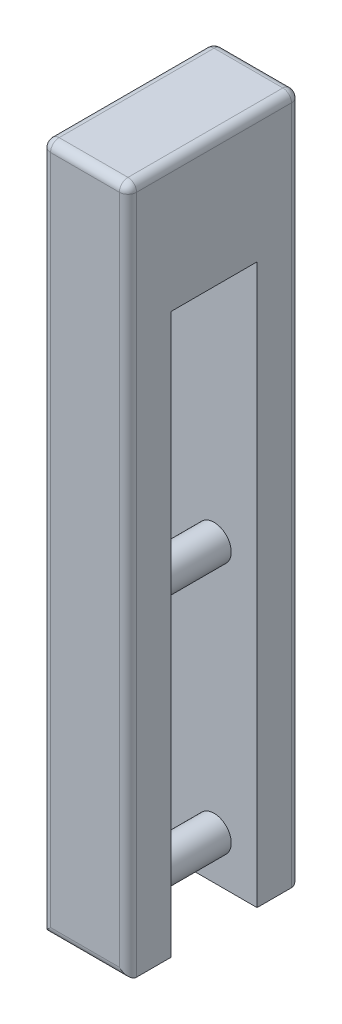
ISO-10303-21;
HEADER;
FILE_DESCRIPTION(('STEP AP214'),'2;1');
FILE_NAME('part.step','',(''),(''),'','','');
FILE_SCHEMA(('AUTOMOTIVE_DESIGN { 1 0 10303 214 1 1 1 1 }'));
ENDSEC;
DATA;
#1=APPLICATION_CONTEXT('core data for automotive mechanical design processes');
#2=APPLICATION_PROTOCOL_DEFINITION('international standard','automotive_design',2000,#1);
#3=PRODUCT_CONTEXT('',#1,'mechanical');
#4=PRODUCT('Part','Part','',(#3));
#5=PRODUCT_RELATED_PRODUCT_CATEGORY('part','',(#4));
#6=PRODUCT_DEFINITION_FORMATION('','',#4);
#7=PRODUCT_DEFINITION_CONTEXT('part definition',#1,'design');
#8=PRODUCT_DEFINITION('design','',#6,#7);
#9=PRODUCT_DEFINITION_SHAPE('','',#8);
#10=(LENGTH_UNIT() NAMED_UNIT(*) SI_UNIT(.MILLI.,.METRE.));
#11=(NAMED_UNIT(*) PLANE_ANGLE_UNIT() SI_UNIT($,.RADIAN.));
#12=(NAMED_UNIT(*) SI_UNIT($,.STERADIAN.) SOLID_ANGLE_UNIT());
#13=UNCERTAINTY_MEASURE_WITH_UNIT(LENGTH_MEASURE(1.E-05),#10,'distance_accuracy_value','');
#14=(GEOMETRIC_REPRESENTATION_CONTEXT(3) GLOBAL_UNCERTAINTY_ASSIGNED_CONTEXT((#13)) GLOBAL_UNIT_ASSIGNED_CONTEXT((#10,
#11,#12)) REPRESENTATION_CONTEXT('',''));
#15=CARTESIAN_POINT('',(0.,0.,0.));
#16=DIRECTION('',(0.,0.,1.));
#17=DIRECTION('',(1.,0.,0.));
#18=AXIS2_PLACEMENT_3D('',#15,#16,#17);
#19=CARTESIAN_POINT('',(0.,0.,5.));
#20=DIRECTION('',(0.,0.,-1.));
#21=DIRECTION('',(-1.,0.,0.));
#22=AXIS2_PLACEMENT_3D('',#19,#20,#21);
#23=PLANE('',#22);
#24=CARTESIAN_POINT('',(5.,5.,5.));
#25=DIRECTION('',(0.,0.,-1.));
#26=DIRECTION('',(-1.,0.,0.));
#27=AXIS2_PLACEMENT_3D('',#24,#25,#26);
#28=CIRCLE('',#27,2.);
#29=CARTESIAN_POINT('',(3.,5.,5.));
#30=VERTEX_POINT('',#29);
#31=EDGE_CURVE('E186',#30,#30,#28,.F.);
#32=ORIENTED_EDGE('',*,*,#31,.F.);
#33=EDGE_LOOP('',(#32));
#34=FACE_BOUND('',#33,.T.);
#35=CARTESIAN_POINT('',(5.,34.2857142857143,5.));
#36=DIRECTION('',(0.,0.,-1.));
#37=DIRECTION('',(-1.,0.,0.));
#38=AXIS2_PLACEMENT_3D('',#35,#36,#37);
#39=CIRCLE('',#38,2.);
#40=CARTESIAN_POINT('',(3.,34.2857142857143,5.));
#41=VERTEX_POINT('',#40);
#42=EDGE_CURVE('E189',#41,#41,#39,.F.);
#43=ORIENTED_EDGE('',*,*,#42,.F.);
#44=EDGE_LOOP('',(#43));
#45=FACE_BOUND('',#44,.T.);
#46=DIRECTION('',(1.,0.,0.));
#47=VECTOR('',#46,1.);
#48=CARTESIAN_POINT('',(0.,65.,5.));
#49=LINE('',#48,#47);
#50=CARTESIAN_POINT('',(0.,65.,5.));
#51=VERTEX_POINT('',#50);
#52=CARTESIAN_POINT('',(10.,65.,5.));
#53=VERTEX_POINT('',#52);
#54=EDGE_CURVE('E143',#51,#53,#49,.T.);
#55=ORIENTED_EDGE('',*,*,#54,.F.);
#56=DIRECTION('',(0.,-1.,0.));
#57=VECTOR('',#56,1.);
#58=CARTESIAN_POINT('',(0.,0.,5.));
#59=LINE('',#58,#57);
#60=CARTESIAN_POINT('',(0.,0.,5.));
#61=VERTEX_POINT('',#60);
#62=EDGE_CURVE('E152',#51,#61,#59,.T.);
#63=ORIENTED_EDGE('',*,*,#62,.T.);
#64=DIRECTION('',(1.,0.,0.));
#65=VECTOR('',#64,1.);
#66=CARTESIAN_POINT('',(0.,0.,5.));
#67=LINE('',#66,#65);
#68=CARTESIAN_POINT('',(10.,0.,5.));
#69=VERTEX_POINT('',#68);
#70=EDGE_CURVE('E176',#61,#69,#67,.T.);
#71=ORIENTED_EDGE('',*,*,#70,.T.);
#72=DIRECTION('',(0.,1.,0.));
#73=VECTOR('',#72,1.);
#74=CARTESIAN_POINT('',(10.,0.,5.));
#75=LINE('',#74,#73);
#76=EDGE_CURVE('E178',#69,#53,#75,.T.);
#77=ORIENTED_EDGE('',*,*,#76,.T.);
#78=EDGE_LOOP('',(#55,#63,#71,#77));
#79=FACE_BOUND('',#78,.T.);
#80=ADVANCED_FACE('F33',(#34,#45,#79),#23,.F.);
#81=CARTESIAN_POINT('',(0.,0.,15.));
#82=DIRECTION('',(0.,0.,1.));
#83=DIRECTION('',(-1.,0.,0.));
#84=AXIS2_PLACEMENT_3D('',#81,#82,#83);
#85=PLANE('',#84);
#86=CARTESIAN_POINT('',(5.,5.,15.));
#87=DIRECTION('',(0.,0.,-1.));
#88=DIRECTION('',(-1.,0.,0.));
#89=AXIS2_PLACEMENT_3D('',#86,#87,#88);
#90=CIRCLE('',#89,2.);
#91=CARTESIAN_POINT('',(3.,5.,15.));
#92=VERTEX_POINT('',#91);
#93=EDGE_CURVE('E169',#92,#92,#90,.F.);
#94=ORIENTED_EDGE('',*,*,#93,.T.);
#95=EDGE_LOOP('',(#94));
#96=FACE_BOUND('',#95,.T.);
#97=CARTESIAN_POINT('',(5.,34.2857142857143,15.));
#98=DIRECTION('',(0.,0.,-1.));
#99=DIRECTION('',(-1.,0.,0.));
#100=AXIS2_PLACEMENT_3D('',#97,#98,#99);
#101=CIRCLE('',#100,2.);
#102=CARTESIAN_POINT('',(3.,34.2857142857143,15.));
#103=VERTEX_POINT('',#102);
#104=EDGE_CURVE('E172',#103,#103,#101,.F.);
#105=ORIENTED_EDGE('',*,*,#104,.T.);
#106=EDGE_LOOP('',(#105));
#107=FACE_BOUND('',#106,.T.);
#108=DIRECTION('',(1.,0.,0.));
#109=VECTOR('',#108,1.);
#110=CARTESIAN_POINT('',(0.,65.,15.));
#111=LINE('',#110,#109);
#112=CARTESIAN_POINT('',(0.,65.,15.));
#113=VERTEX_POINT('',#112);
#114=CARTESIAN_POINT('',(10.,65.,15.));
#115=VERTEX_POINT('',#114);
#116=EDGE_CURVE('E133',#113,#115,#111,.T.);
#117=ORIENTED_EDGE('',*,*,#116,.T.);
#118=DIRECTION('',(0.,1.,0.));
#119=VECTOR('',#118,1.);
#120=CARTESIAN_POINT('',(10.,0.,15.));
#121=LINE('',#120,#119);
#122=CARTESIAN_POINT('',(10.,0.,15.));
#123=VERTEX_POINT('',#122);
#124=EDGE_CURVE('E159',#123,#115,#121,.T.);
#125=ORIENTED_EDGE('',*,*,#124,.F.);
#126=DIRECTION('',(1.,0.,0.));
#127=VECTOR('',#126,1.);
#128=CARTESIAN_POINT('',(0.,0.,15.));
#129=LINE('',#128,#127);
#130=CARTESIAN_POINT('',(0.,0.,15.));
#131=VERTEX_POINT('',#130);
#132=EDGE_CURVE('E156',#131,#123,#129,.T.);
#133=ORIENTED_EDGE('',*,*,#132,.F.);
#134=DIRECTION('',(0.,-1.,0.));
#135=VECTOR('',#134,1.);
#136=CARTESIAN_POINT('',(0.,0.,15.));
#137=LINE('',#136,#135);
#138=EDGE_CURVE('E149',#113,#131,#137,.T.);
#139=ORIENTED_EDGE('',*,*,#138,.F.);
#140=EDGE_LOOP('',(#117,#125,#133,#139));
#141=FACE_BOUND('',#140,.T.);
#142=ADVANCED_FACE('F154',(#96,#107,#141),#85,.F.);
#143=CARTESIAN_POINT('',(0.,0.,5.));
#144=DIRECTION('',(1.,0.,0.));
#145=DIRECTION('',(0.,0.,-1.));
#146=AXIS2_PLACEMENT_3D('',#143,#144,#145);
#147=PLANE('',#146);
#148=DIRECTION('',(0.,0.,1.));
#149=VECTOR('',#148,1.);
#150=CARTESIAN_POINT('',(0.,0.,15.));
#151=LINE('',#150,#149);
#152=CARTESIAN_POINT('',(0.,0.,19.));
#153=VERTEX_POINT('',#152);
#154=EDGE_CURVE('E167',#131,#153,#151,.T.);
#155=ORIENTED_EDGE('',*,*,#154,.T.);
#156=DIRECTION('',(0.,-1.,0.));
#157=VECTOR('',#156,1.);
#158=CARTESIAN_POINT('',(0.,80.,19.));
#159=LINE('',#158,#157);
#160=CARTESIAN_POINT('',(0.,79.,19.));
#161=VERTEX_POINT('',#160);
#162=EDGE_CURVE('E214',#153,#161,#159,.F.);
#163=ORIENTED_EDGE('',*,*,#162,.T.);
#164=DIRECTION('',(0.,0.,-1.));
#165=VECTOR('',#164,1.);
#166=CARTESIAN_POINT('',(0.,79.,5.));
#167=LINE('',#166,#165);
#168=CARTESIAN_POINT('',(0.,79.,1.));
#169=VERTEX_POINT('',#168);
#170=EDGE_CURVE('E212',#161,#169,#167,.T.);
#171=ORIENTED_EDGE('',*,*,#170,.T.);
#172=DIRECTION('',(0.,-1.,0.));
#173=VECTOR('',#172,1.);
#174=CARTESIAN_POINT('',(0.,0.,1.));
#175=LINE('',#174,#173);
#176=CARTESIAN_POINT('',(0.,0.,1.));
#177=VERTEX_POINT('',#176);
#178=EDGE_CURVE('E210',#169,#177,#175,.T.);
#179=ORIENTED_EDGE('',*,*,#178,.T.);
#180=DIRECTION('',(0.,0.,-1.));
#181=VECTOR('',#180,1.);
#182=CARTESIAN_POINT('',(0.,0.,5.));
#183=LINE('',#182,#181);
#184=EDGE_CURVE('E183',#61,#177,#183,.T.);
#185=ORIENTED_EDGE('',*,*,#184,.F.);
#186=ORIENTED_EDGE('',*,*,#62,.F.);
#187=DIRECTION('',(0.,0.,-1.));
#188=VECTOR('',#187,1.);
#189=CARTESIAN_POINT('',(0.,65.,15.));
#190=LINE('',#189,#188);
#191=EDGE_CURVE('E137',#113,#51,#190,.T.);
#192=ORIENTED_EDGE('',*,*,#191,.F.);
#193=ORIENTED_EDGE('',*,*,#138,.T.);
#194=EDGE_LOOP('',(#155,#163,#171,#179,#185,#186,#192,#193));
#195=FACE_BOUND('',#194,.T.);
#196=ADVANCED_FACE('F148',(#195),#147,.F.);
#197=CARTESIAN_POINT('',(0.,0.,5.));
#198=DIRECTION('',(0.,1.,0.));
#199=DIRECTION('',(0.,0.,1.));
#200=AXIS2_PLACEMENT_3D('',#197,#198,#199);
#201=PLANE('',#200);
#202=ORIENTED_EDGE('',*,*,#184,.T.);
#203=DIRECTION('',(1.,0.,0.));
#204=VECTOR('',#203,1.);
#205=CARTESIAN_POINT('',(10.,0.,1.));
#206=LINE('',#205,#204);
#207=CARTESIAN_POINT('',(10.,0.,1.));
#208=VERTEX_POINT('',#207);
#209=EDGE_CURVE('E225',#177,#208,#206,.T.);
#210=ORIENTED_EDGE('',*,*,#209,.T.);
#211=DIRECTION('',(0.,0.,-1.));
#212=VECTOR('',#211,1.);
#213=CARTESIAN_POINT('',(10.,0.,5.));
#214=LINE('',#213,#212);
#215=EDGE_CURVE('E180',#69,#208,#214,.T.);
#216=ORIENTED_EDGE('',*,*,#215,.F.);
#217=ORIENTED_EDGE('',*,*,#70,.F.);
#218=EDGE_LOOP('',(#202,#210,#216,#217));
#219=FACE_BOUND('',#218,.T.);
#220=ADVANCED_FACE('F321',(#219),#201,.F.);
#221=CARTESIAN_POINT('',(10.,0.,5.));
#222=DIRECTION('',(-1.,0.,0.));
#223=DIRECTION('',(0.,0.,1.));
#224=AXIS2_PLACEMENT_3D('',#221,#222,#223);
#225=PLANE('',#224);
#226=DIRECTION('',(0.,0.,-1.));
#227=VECTOR('',#226,1.);
#228=CARTESIAN_POINT('',(10.,79.,5.));
#229=LINE('',#228,#227);
#230=CARTESIAN_POINT('',(10.,79.,1.));
#231=VERTEX_POINT('',#230);
#232=CARTESIAN_POINT('',(10.,79.,19.));
#233=VERTEX_POINT('',#232);
#234=EDGE_CURVE('E203',#231,#233,#229,.F.);
#235=ORIENTED_EDGE('',*,*,#234,.T.);
#236=DIRECTION('',(0.,1.,0.));
#237=VECTOR('',#236,1.);
#238=CARTESIAN_POINT('',(10.,0.,19.));
#239=LINE('',#238,#237);
#240=CARTESIAN_POINT('',(10.,0.,19.));
#241=VERTEX_POINT('',#240);
#242=EDGE_CURVE('E205',#233,#241,#239,.F.);
#243=ORIENTED_EDGE('',*,*,#242,.T.);
#244=DIRECTION('',(0.,0.,1.));
#245=VECTOR('',#244,1.);
#246=CARTESIAN_POINT('',(10.,0.,15.));
#247=LINE('',#246,#245);
#248=EDGE_CURVE('E164',#123,#241,#247,.T.);
#249=ORIENTED_EDGE('',*,*,#248,.F.);
#250=ORIENTED_EDGE('',*,*,#124,.T.);
#251=DIRECTION('',(0.,0.,-1.));
#252=VECTOR('',#251,1.);
#253=CARTESIAN_POINT('',(10.,65.,15.));
#254=LINE('',#253,#252);
#255=EDGE_CURVE('E139',#115,#53,#254,.T.);
#256=ORIENTED_EDGE('',*,*,#255,.T.);
#257=ORIENTED_EDGE('',*,*,#76,.F.);
#258=ORIENTED_EDGE('',*,*,#215,.T.);
#259=DIRECTION('',(0.,1.,0.));
#260=VECTOR('',#259,1.);
#261=CARTESIAN_POINT('',(10.,80.,1.));
#262=LINE('',#261,#260);
#263=EDGE_CURVE('E201',#208,#231,#262,.T.);
#264=ORIENTED_EDGE('',*,*,#263,.T.);
#265=EDGE_LOOP('',(#235,#243,#249,#250,#256,#257,#258,#264));
#266=FACE_BOUND('',#265,.T.);
#267=ADVANCED_FACE('F282',(#266),#225,.F.);
#268=CARTESIAN_POINT('',(0.,80.,5.));
#269=DIRECTION('',(0.,-1.,0.));
#270=DIRECTION('',(0.,0.,-1.));
#271=AXIS2_PLACEMENT_3D('',#268,#269,#270);
#272=PLANE('',#271);
#273=DIRECTION('',(-1.,0.,0.));
#274=VECTOR('',#273,1.);
#275=CARTESIAN_POINT('',(10.,80.,19.));
#276=LINE('',#275,#274);
#277=CARTESIAN_POINT('',(1.,80.,19.));
#278=VERTEX_POINT('',#277);
#279=CARTESIAN_POINT('',(9.,80.,19.));
#280=VERTEX_POINT('',#279);
#281=EDGE_CURVE('E220',#278,#280,#276,.F.);
#282=ORIENTED_EDGE('',*,*,#281,.T.);
#283=DIRECTION('',(0.,0.,-1.));
#284=VECTOR('',#283,1.);
#285=CARTESIAN_POINT('',(9.,80.,5.));
#286=LINE('',#285,#284);
#287=CARTESIAN_POINT('',(9.,80.,1.));
#288=VERTEX_POINT('',#287);
#289=EDGE_CURVE('E222',#280,#288,#286,.T.);
#290=ORIENTED_EDGE('',*,*,#289,.T.);
#291=DIRECTION('',(-1.,0.,0.));
#292=VECTOR('',#291,1.);
#293=CARTESIAN_POINT('',(0.,80.,1.));
#294=LINE('',#293,#292);
#295=CARTESIAN_POINT('',(1.,80.,1.));
#296=VERTEX_POINT('',#295);
#297=EDGE_CURVE('E216',#288,#296,#294,.T.);
#298=ORIENTED_EDGE('',*,*,#297,.T.);
#299=DIRECTION('',(0.,0.,-1.));
#300=VECTOR('',#299,1.);
#301=CARTESIAN_POINT('',(1.,80.,5.));
#302=LINE('',#301,#300);
#303=EDGE_CURVE('E218',#296,#278,#302,.F.);
#304=ORIENTED_EDGE('',*,*,#303,.T.);
#305=EDGE_LOOP('',(#282,#290,#298,#304));
#306=FACE_BOUND('',#305,.T.);
#307=ADVANCED_FACE('F366',(#306),#272,.F.);
#308=CARTESIAN_POINT('',(0.,0.,0.));
#309=DIRECTION('',(0.,0.,-1.));
#310=DIRECTION('',(-1.,0.,0.));
#311=AXIS2_PLACEMENT_3D('',#308,#309,#310);
#312=PLANE('',#311);
#313=DIRECTION('',(0.,1.,0.));
#314=VECTOR('',#313,1.);
#315=CARTESIAN_POINT('',(9.,0.,0.));
#316=LINE('',#315,#314);
#317=CARTESIAN_POINT('',(9.,79.,0.));
#318=VERTEX_POINT('',#317);
#319=CARTESIAN_POINT('',(9.,1.,0.));
#320=VERTEX_POINT('',#319);
#321=EDGE_CURVE('E42',#318,#320,#316,.F.);
#322=ORIENTED_EDGE('',*,*,#321,.T.);
#323=DIRECTION('',(1.,0.,0.));
#324=VECTOR('',#323,1.);
#325=CARTESIAN_POINT('',(0.,1.,0.));
#326=LINE('',#325,#324);
#327=CARTESIAN_POINT('',(1.,1.,0.));
#328=VERTEX_POINT('',#327);
#329=EDGE_CURVE('E11',#320,#328,#326,.F.);
#330=ORIENTED_EDGE('',*,*,#329,.T.);
#331=DIRECTION('',(0.,-1.,0.));
#332=VECTOR('',#331,1.);
#333=CARTESIAN_POINT('',(1.,80.,0.));
#334=LINE('',#333,#332);
#335=CARTESIAN_POINT('',(1.,79.,0.));
#336=VERTEX_POINT('',#335);
#337=EDGE_CURVE('E227',#328,#336,#334,.F.);
#338=ORIENTED_EDGE('',*,*,#337,.T.);
#339=DIRECTION('',(-1.,0.,0.));
#340=VECTOR('',#339,1.);
#341=CARTESIAN_POINT('',(10.,79.,0.));
#342=LINE('',#341,#340);
#343=EDGE_CURVE('E53',#336,#318,#342,.F.);
#344=ORIENTED_EDGE('',*,*,#343,.T.);
#345=EDGE_LOOP('',(#322,#330,#338,#344));
#346=FACE_BOUND('',#345,.T.);
#347=ADVANCED_FACE('F363',(#346),#312,.T.);
#348=CARTESIAN_POINT('',(5.,5.,10.));
#349=DIRECTION('',(0.,0.,-1.));
#350=DIRECTION('',(-1.,0.,0.));
#351=AXIS2_PLACEMENT_3D('',#348,#349,#350);
#352=CYLINDRICAL_SURFACE('',#351,2.);
#353=ORIENTED_EDGE('',*,*,#31,.T.);
#354=EDGE_LOOP('',(#353));
#355=FACE_BOUND('',#354,.T.);
#356=ORIENTED_EDGE('',*,*,#93,.F.);
#357=EDGE_LOOP('',(#356));
#358=FACE_BOUND('',#357,.T.);
#359=ADVANCED_FACE('F361',(#355,#358),#352,.T.);
#360=CARTESIAN_POINT('',(5.,34.2857142857143,10.));
#361=DIRECTION('',(0.,0.,-1.));
#362=DIRECTION('',(-1.,0.,0.));
#363=AXIS2_PLACEMENT_3D('',#360,#361,#362);
#364=CYLINDRICAL_SURFACE('',#363,2.);
#365=ORIENTED_EDGE('',*,*,#42,.T.);
#366=EDGE_LOOP('',(#365));
#367=FACE_BOUND('',#366,.T.);
#368=ORIENTED_EDGE('',*,*,#104,.F.);
#369=EDGE_LOOP('',(#368));
#370=FACE_BOUND('',#369,.T.);
#371=ADVANCED_FACE('F403',(#367,#370),#364,.T.);
#372=CARTESIAN_POINT('',(0.,0.,15.));
#373=DIRECTION('',(0.,1.,0.));
#374=DIRECTION('',(0.,0.,-1.));
#375=AXIS2_PLACEMENT_3D('',#372,#373,#374);
#376=PLANE('',#375);
#377=ORIENTED_EDGE('',*,*,#248,.T.);
#378=DIRECTION('',(1.,0.,0.));
#379=VECTOR('',#378,1.);
#380=CARTESIAN_POINT('',(0.,0.,19.));
#381=LINE('',#380,#379);
#382=EDGE_CURVE('E208',#241,#153,#381,.F.);
#383=ORIENTED_EDGE('',*,*,#382,.T.);
#384=ORIENTED_EDGE('',*,*,#154,.F.);
#385=ORIENTED_EDGE('',*,*,#132,.T.);
#386=EDGE_LOOP('',(#377,#383,#384,#385));
#387=FACE_BOUND('',#386,.T.);
#388=ADVANCED_FACE('F286',(#387),#376,.F.);
#389=CARTESIAN_POINT('',(0.,0.,20.));
#390=DIRECTION('',(0.,0.,1.));
#391=DIRECTION('',(-1.,0.,0.));
#392=AXIS2_PLACEMENT_3D('',#389,#390,#391);
#393=PLANE('',#392);
#394=DIRECTION('',(1.,0.,0.));
#395=VECTOR('',#394,1.);
#396=CARTESIAN_POINT('',(10.,1.,20.));
#397=LINE('',#396,#395);
#398=CARTESIAN_POINT('',(1.,1.,20.));
#399=VERTEX_POINT('',#398);
#400=CARTESIAN_POINT('',(9.,1.,20.));
#401=VERTEX_POINT('',#400);
#402=EDGE_CURVE('E196',#399,#401,#397,.T.);
#403=ORIENTED_EDGE('',*,*,#402,.T.);
#404=DIRECTION('',(0.,1.,0.));
#405=VECTOR('',#404,1.);
#406=CARTESIAN_POINT('',(9.,80.,20.));
#407=LINE('',#406,#405);
#408=CARTESIAN_POINT('',(9.,79.,20.));
#409=VERTEX_POINT('',#408);
#410=EDGE_CURVE('E198',#401,#409,#407,.T.);
#411=ORIENTED_EDGE('',*,*,#410,.T.);
#412=DIRECTION('',(-1.,0.,0.));
#413=VECTOR('',#412,1.);
#414=CARTESIAN_POINT('',(0.,79.,20.));
#415=LINE('',#414,#413);
#416=CARTESIAN_POINT('',(1.,79.,20.));
#417=VERTEX_POINT('',#416);
#418=EDGE_CURVE('E192',#409,#417,#415,.T.);
#419=ORIENTED_EDGE('',*,*,#418,.T.);
#420=DIRECTION('',(0.,-1.,0.));
#421=VECTOR('',#420,1.);
#422=CARTESIAN_POINT('',(1.,0.,20.));
#423=LINE('',#422,#421);
#424=EDGE_CURVE('E194',#417,#399,#423,.T.);
#425=ORIENTED_EDGE('',*,*,#424,.T.);
#426=EDGE_LOOP('',(#403,#411,#419,#425));
#427=FACE_BOUND('',#426,.T.);
#428=ADVANCED_FACE('F301',(#427),#393,.T.);
#429=CARTESIAN_POINT('',(0.,65.,15.));
#430=DIRECTION('',(0.,1.,0.));
#431=DIRECTION('',(0.,0.,1.));
#432=AXIS2_PLACEMENT_3D('',#429,#430,#431);
#433=PLANE('',#432);
#434=ORIENTED_EDGE('',*,*,#54,.T.);
#435=ORIENTED_EDGE('',*,*,#255,.F.);
#436=ORIENTED_EDGE('',*,*,#116,.F.);
#437=ORIENTED_EDGE('',*,*,#191,.T.);
#438=EDGE_LOOP('',(#434,#435,#436,#437));
#439=FACE_BOUND('',#438,.T.);
#440=ADVANCED_FACE('F136',(#439),#433,.F.);
#441=CARTESIAN_POINT('',(1.,0.,1.));
#442=DIRECTION('',(0.,1.,0.));
#443=DIRECTION('',(0.,0.,1.));
#444=AXIS2_PLACEMENT_3D('',#441,#442,#443);
#445=CYLINDRICAL_SURFACE('',#444,1.);
#446=CARTESIAN_POINT('',(1.,79.,1.));
#447=DIRECTION('',(0.,1.,0.));
#448=DIRECTION('',(0.,0.,1.));
#449=AXIS2_PLACEMENT_3D('',#446,#447,#448);
#450=CIRCLE('',#449,1.);
#451=EDGE_CURVE('E37',#336,#169,#450,.T.);
#452=ORIENTED_EDGE('',*,*,#451,.F.);
#453=ORIENTED_EDGE('',*,*,#337,.F.);
#454=CARTESIAN_POINT('',(1.,1.,1.));
#455=DIRECTION('',(-0.707106781186547,0.707106781186547,0.));
#456=DIRECTION('',(0.707106781186547,0.707106781186547,0.));
#457=AXIS2_PLACEMENT_3D('',#454,#455,#456);
#458=ELLIPSE('',#457,1.41421356237309,1.);
#459=EDGE_CURVE('E269',#177,#328,#458,.F.);
#460=ORIENTED_EDGE('',*,*,#459,.F.);
#461=ORIENTED_EDGE('',*,*,#178,.F.);
#462=EDGE_LOOP('',(#452,#453,#460,#461));
#463=FACE_BOUND('',#462,.T.);
#464=ADVANCED_FACE('F35',(#463),#445,.T.);
#465=CARTESIAN_POINT('',(1.,79.,1.));
#466=DIRECTION('',(0.,0.,1.));
#467=DIRECTION('',(1.,0.,0.));
#468=AXIS2_PLACEMENT_3D('',#465,#466,#467);
#469=SPHERICAL_SURFACE('',#468,1.);
#470=CARTESIAN_POINT('',(1.,79.,1.));
#471=DIRECTION('',(-1.,0.,0.));
#472=DIRECTION('',(0.,0.,1.));
#473=AXIS2_PLACEMENT_3D('',#470,#471,#472);
#474=CIRCLE('',#473,1.);
#475=EDGE_CURVE('E264',#336,#296,#474,.F.);
#476=ORIENTED_EDGE('',*,*,#475,.F.);
#477=ORIENTED_EDGE('',*,*,#451,.T.);
#478=CARTESIAN_POINT('',(1.,79.,1.));
#479=DIRECTION('',(0.,0.,-1.));
#480=DIRECTION('',(-1.,0.,0.));
#481=AXIS2_PLACEMENT_3D('',#478,#479,#480);
#482=CIRCLE('',#481,1.);
#483=EDGE_CURVE('E267',#296,#169,#482,.F.);
#484=ORIENTED_EDGE('',*,*,#483,.F.);
#485=EDGE_LOOP('',(#476,#477,#484));
#486=FACE_BOUND('',#485,.T.);
#487=ADVANCED_FACE('F432',(#486),#469,.T.);
#488=CARTESIAN_POINT('',(0.,1.,1.));
#489=DIRECTION('',(-1.,0.,0.));
#490=DIRECTION('',(0.,0.,1.));
#491=AXIS2_PLACEMENT_3D('',#488,#489,#490);
#492=CYLINDRICAL_SURFACE('',#491,1.);
#493=ORIENTED_EDGE('',*,*,#459,.T.);
#494=ORIENTED_EDGE('',*,*,#329,.F.);
#495=CARTESIAN_POINT('',(9.,1.,1.));
#496=DIRECTION('',(-0.707106781186547,-0.707106781186547,0.));
#497=DIRECTION('',(0.707106781186547,-0.707106781186547,0.));
#498=AXIS2_PLACEMENT_3D('',#495,#496,#497);
#499=ELLIPSE('',#498,1.41421356237309,1.);
#500=EDGE_CURVE('E261',#208,#320,#499,.F.);
#501=ORIENTED_EDGE('',*,*,#500,.F.);
#502=ORIENTED_EDGE('',*,*,#209,.F.);
#503=EDGE_LOOP('',(#493,#494,#501,#502));
#504=FACE_BOUND('',#503,.T.);
#505=ADVANCED_FACE('F317',(#504),#492,.T.);
#506=CARTESIAN_POINT('',(1.,79.,5.));
#507=DIRECTION('',(0.,0.,-1.));
#508=DIRECTION('',(-1.,0.,0.));
#509=AXIS2_PLACEMENT_3D('',#506,#507,#508);
#510=CYLINDRICAL_SURFACE('',#509,1.);
#511=ORIENTED_EDGE('',*,*,#483,.T.);
#512=ORIENTED_EDGE('',*,*,#170,.F.);
#513=CARTESIAN_POINT('',(1.,79.,19.));
#514=DIRECTION('',(0.,0.,1.));
#515=DIRECTION('',(1.,0.,0.));
#516=AXIS2_PLACEMENT_3D('',#513,#514,#515);
#517=CIRCLE('',#516,1.);
#518=EDGE_CURVE('E258',#278,#161,#517,.T.);
#519=ORIENTED_EDGE('',*,*,#518,.F.);
#520=ORIENTED_EDGE('',*,*,#303,.F.);
#521=EDGE_LOOP('',(#511,#512,#519,#520));
#522=FACE_BOUND('',#521,.T.);
#523=ADVANCED_FACE('F313',(#522),#510,.T.);
#524=CARTESIAN_POINT('',(0.,79.,1.));
#525=DIRECTION('',(1.,0.,0.));
#526=DIRECTION('',(0.,0.,-1.));
#527=AXIS2_PLACEMENT_3D('',#524,#525,#526);
#528=CYLINDRICAL_SURFACE('',#527,1.);
#529=ORIENTED_EDGE('',*,*,#475,.T.);
#530=ORIENTED_EDGE('',*,*,#297,.F.);
#531=CARTESIAN_POINT('',(9.,79.,1.));
#532=DIRECTION('',(1.,0.,0.));
#533=DIRECTION('',(0.,0.,-1.));
#534=AXIS2_PLACEMENT_3D('',#531,#532,#533);
#535=CIRCLE('',#534,1.);
#536=EDGE_CURVE('E255',#318,#288,#535,.T.);
#537=ORIENTED_EDGE('',*,*,#536,.F.);
#538=ORIENTED_EDGE('',*,*,#343,.F.);
#539=EDGE_LOOP('',(#529,#530,#537,#538));
#540=FACE_BOUND('',#539,.T.);
#541=ADVANCED_FACE('F449',(#540),#528,.T.);
#542=CARTESIAN_POINT('',(9.,0.,1.));
#543=DIRECTION('',(0.,-1.,0.));
#544=DIRECTION('',(0.,0.,-1.));
#545=AXIS2_PLACEMENT_3D('',#542,#543,#544);
#546=CYLINDRICAL_SURFACE('',#545,1.);
#547=ORIENTED_EDGE('',*,*,#500,.T.);
#548=ORIENTED_EDGE('',*,*,#321,.F.);
#549=CARTESIAN_POINT('',(9.,79.,1.));
#550=DIRECTION('',(0.,1.,0.));
#551=DIRECTION('',(0.,0.,1.));
#552=AXIS2_PLACEMENT_3D('',#549,#550,#551);
#553=CIRCLE('',#552,1.);
#554=EDGE_CURVE('E252',#231,#318,#553,.T.);
#555=ORIENTED_EDGE('',*,*,#554,.F.);
#556=ORIENTED_EDGE('',*,*,#263,.F.);
#557=EDGE_LOOP('',(#547,#548,#555,#556));
#558=FACE_BOUND('',#557,.T.);
#559=ADVANCED_FACE('F328',(#558),#546,.T.);
#560=CARTESIAN_POINT('',(1.,79.,19.));
#561=DIRECTION('',(0.,0.,1.));
#562=DIRECTION('',(1.,0.,0.));
#563=AXIS2_PLACEMENT_3D('',#560,#561,#562);
#564=SPHERICAL_SURFACE('',#563,1.);
#565=CARTESIAN_POINT('',(1.,79.,19.));
#566=DIRECTION('',(-1.,0.,0.));
#567=DIRECTION('',(0.,0.,1.));
#568=AXIS2_PLACEMENT_3D('',#565,#566,#567);
#569=CIRCLE('',#568,1.);
#570=EDGE_CURVE('E246',#278,#417,#569,.F.);
#571=ORIENTED_EDGE('',*,*,#570,.F.);
#572=ORIENTED_EDGE('',*,*,#518,.T.);
#573=CARTESIAN_POINT('',(1.,79.,19.));
#574=DIRECTION('',(0.,1.,0.));
#575=DIRECTION('',(0.,0.,1.));
#576=AXIS2_PLACEMENT_3D('',#573,#574,#575);
#577=CIRCLE('',#576,1.);
#578=EDGE_CURVE('E249',#417,#161,#577,.F.);
#579=ORIENTED_EDGE('',*,*,#578,.F.);
#580=EDGE_LOOP('',(#571,#572,#579));
#581=FACE_BOUND('',#580,.T.);
#582=ADVANCED_FACE('F309',(#581),#564,.T.);
#583=CARTESIAN_POINT('',(9.,79.,1.));
#584=DIRECTION('',(0.,0.,1.));
#585=DIRECTION('',(1.,0.,0.));
#586=AXIS2_PLACEMENT_3D('',#583,#584,#585);
#587=SPHERICAL_SURFACE('',#586,1.);
#588=ORIENTED_EDGE('',*,*,#554,.T.);
#589=ORIENTED_EDGE('',*,*,#536,.T.);
#590=CARTESIAN_POINT('',(9.,79.,1.));
#591=DIRECTION('',(0.,0.,-1.));
#592=DIRECTION('',(-1.,0.,0.));
#593=AXIS2_PLACEMENT_3D('',#590,#591,#592);
#594=CIRCLE('',#593,1.);
#595=EDGE_CURVE('E244',#231,#288,#594,.F.);
#596=ORIENTED_EDGE('',*,*,#595,.F.);
#597=EDGE_LOOP('',(#588,#589,#596));
#598=FACE_BOUND('',#597,.T.);
#599=ADVANCED_FACE('F331',(#598),#587,.T.);
#600=CARTESIAN_POINT('',(1.,0.,19.));
#601=DIRECTION('',(0.,1.,0.));
#602=DIRECTION('',(0.,0.,1.));
#603=AXIS2_PLACEMENT_3D('',#600,#601,#602);
#604=CYLINDRICAL_SURFACE('',#603,1.);
#605=ORIENTED_EDGE('',*,*,#578,.T.);
#606=ORIENTED_EDGE('',*,*,#162,.F.);
#607=CARTESIAN_POINT('',(1.,1.,19.));
#608=DIRECTION('',(-0.707106781186547,0.707106781186547,0.));
#609=DIRECTION('',(0.707106781186547,0.707106781186547,0.));
#610=AXIS2_PLACEMENT_3D('',#607,#608,#609);
#611=ELLIPSE('',#610,1.41421356237309,1.);
#612=EDGE_CURVE('E241',#399,#153,#611,.F.);
#613=ORIENTED_EDGE('',*,*,#612,.F.);
#614=ORIENTED_EDGE('',*,*,#424,.F.);
#615=EDGE_LOOP('',(#605,#606,#613,#614));
#616=FACE_BOUND('',#615,.T.);
#617=ADVANCED_FACE('F292',(#616),#604,.T.);
#618=CARTESIAN_POINT('',(0.,79.,19.));
#619=DIRECTION('',(1.,0.,0.));
#620=DIRECTION('',(0.,0.,-1.));
#621=AXIS2_PLACEMENT_3D('',#618,#619,#620);
#622=CYLINDRICAL_SURFACE('',#621,1.);
#623=ORIENTED_EDGE('',*,*,#570,.T.);
#624=ORIENTED_EDGE('',*,*,#418,.F.);
#625=CARTESIAN_POINT('',(9.,79.,19.));
#626=DIRECTION('',(1.,0.,0.));
#627=DIRECTION('',(0.,0.,-1.));
#628=AXIS2_PLACEMENT_3D('',#625,#626,#627);
#629=CIRCLE('',#628,1.);
#630=EDGE_CURVE('E238',#280,#409,#629,.T.);
#631=ORIENTED_EDGE('',*,*,#630,.F.);
#632=ORIENTED_EDGE('',*,*,#281,.F.);
#633=EDGE_LOOP('',(#623,#624,#631,#632));
#634=FACE_BOUND('',#633,.T.);
#635=ADVANCED_FACE('F307',(#634),#622,.T.);
#636=CARTESIAN_POINT('',(9.,79.,5.));
#637=DIRECTION('',(0.,0.,-1.));
#638=DIRECTION('',(-1.,0.,0.));
#639=AXIS2_PLACEMENT_3D('',#636,#637,#638);
#640=CYLINDRICAL_SURFACE('',#639,1.);
#641=ORIENTED_EDGE('',*,*,#595,.T.);
#642=ORIENTED_EDGE('',*,*,#289,.F.);
#643=CARTESIAN_POINT('',(9.,79.,19.));
#644=DIRECTION('',(0.,0.,1.));
#645=DIRECTION('',(1.,0.,0.));
#646=AXIS2_PLACEMENT_3D('',#643,#644,#645);
#647=CIRCLE('',#646,1.);
#648=EDGE_CURVE('E235',#233,#280,#647,.T.);
#649=ORIENTED_EDGE('',*,*,#648,.F.);
#650=ORIENTED_EDGE('',*,*,#234,.F.);
#651=EDGE_LOOP('',(#641,#642,#649,#650));
#652=FACE_BOUND('',#651,.T.);
#653=ADVANCED_FACE('F335',(#652),#640,.T.);
#654=CARTESIAN_POINT('',(0.,1.,19.));
#655=DIRECTION('',(-1.,0.,0.));
#656=DIRECTION('',(0.,0.,1.));
#657=AXIS2_PLACEMENT_3D('',#654,#655,#656);
#658=CYLINDRICAL_SURFACE('',#657,1.);
#659=ORIENTED_EDGE('',*,*,#612,.T.);
#660=ORIENTED_EDGE('',*,*,#382,.F.);
#661=CARTESIAN_POINT('',(9.,1.,19.));
#662=DIRECTION('',(-0.707106781186547,-0.707106781186547,0.));
#663=DIRECTION('',(-0.707106781186547,0.707106781186547,0.));
#664=AXIS2_PLACEMENT_3D('',#661,#662,#663);
#665=ELLIPSE('',#664,1.41421356237309,1.);
#666=EDGE_CURVE('E233',#401,#241,#665,.F.);
#667=ORIENTED_EDGE('',*,*,#666,.F.);
#668=ORIENTED_EDGE('',*,*,#402,.F.);
#669=EDGE_LOOP('',(#659,#660,#667,#668));
#670=FACE_BOUND('',#669,.T.);
#671=ADVANCED_FACE('F297',(#670),#658,.T.);
#672=CARTESIAN_POINT('',(9.,79.,19.));
#673=DIRECTION('',(0.,0.,1.));
#674=DIRECTION('',(1.,0.,0.));
#675=AXIS2_PLACEMENT_3D('',#672,#673,#674);
#676=SPHERICAL_SURFACE('',#675,1.);
#677=ORIENTED_EDGE('',*,*,#648,.T.);
#678=ORIENTED_EDGE('',*,*,#630,.T.);
#679=CARTESIAN_POINT('',(9.,79.,19.));
#680=DIRECTION('',(0.,1.,0.));
#681=DIRECTION('',(0.,0.,1.));
#682=AXIS2_PLACEMENT_3D('',#679,#680,#681);
#683=CIRCLE('',#682,1.);
#684=EDGE_CURVE('E231',#233,#409,#683,.F.);
#685=ORIENTED_EDGE('',*,*,#684,.F.);
#686=EDGE_LOOP('',(#677,#678,#685));
#687=FACE_BOUND('',#686,.T.);
#688=ADVANCED_FACE('F340',(#687),#676,.T.);
#689=CARTESIAN_POINT('',(9.,0.,19.));
#690=DIRECTION('',(0.,-1.,0.));
#691=DIRECTION('',(0.,0.,-1.));
#692=AXIS2_PLACEMENT_3D('',#689,#690,#691);
#693=CYLINDRICAL_SURFACE('',#692,1.);
#694=ORIENTED_EDGE('',*,*,#666,.T.);
#695=ORIENTED_EDGE('',*,*,#242,.F.);
#696=ORIENTED_EDGE('',*,*,#684,.T.);
#697=ORIENTED_EDGE('',*,*,#410,.F.);
#698=EDGE_LOOP('',(#694,#695,#696,#697));
#699=FACE_BOUND('',#698,.T.);
#700=ADVANCED_FACE('F339',(#699),#693,.T.);
#701=CLOSED_SHELL('',(#80,#142,#196,#220,#267,#307,#347,#359,#371,#388,#428,#440,#464,#487,#505,
#523,#541,#559,#582,#599,#617,#635,#653,#671,#688,#700));
#702=MANIFOLD_SOLID_BREP('B2',#701);
#703=ADVANCED_BREP_SHAPE_REPRESENTATION('',(#18,#702),#14);
#704=SHAPE_DEFINITION_REPRESENTATION(#9,#703);
ENDSEC;
END-ISO-10303-21;
